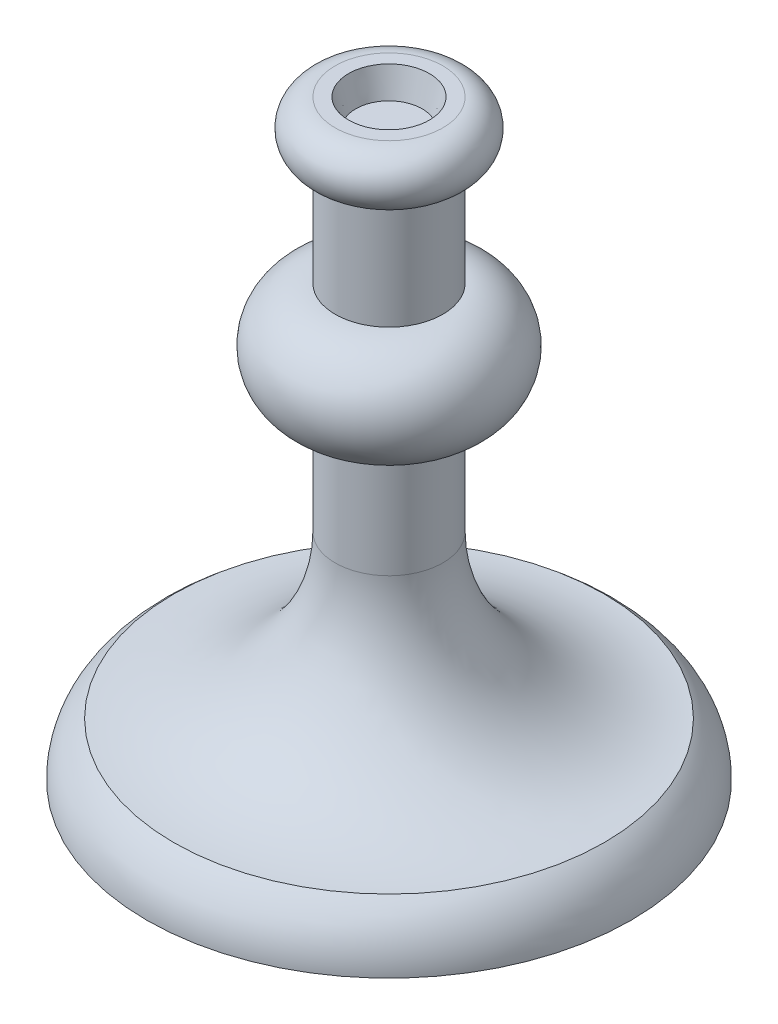
ISO-10303-21;
HEADER;
FILE_DESCRIPTION(('STEP AP214'),'2;1');
FILE_NAME('part.step','',(''),(''),'','','');
FILE_SCHEMA(('AUTOMOTIVE_DESIGN { 1 0 10303 214 1 1 1 1 }'));
ENDSEC;
DATA;
#1=APPLICATION_CONTEXT('core data for automotive mechanical design processes');
#2=APPLICATION_PROTOCOL_DEFINITION('international standard','automotive_design',2000,#1);
#3=PRODUCT_CONTEXT('',#1,'mechanical');
#4=PRODUCT('Part','Part','',(#3));
#5=PRODUCT_RELATED_PRODUCT_CATEGORY('part','',(#4));
#6=PRODUCT_DEFINITION_FORMATION('','',#4);
#7=PRODUCT_DEFINITION_CONTEXT('part definition',#1,'design');
#8=PRODUCT_DEFINITION('design','',#6,#7);
#9=PRODUCT_DEFINITION_SHAPE('','',#8);
#10=(LENGTH_UNIT() NAMED_UNIT(*) SI_UNIT(.MILLI.,.METRE.));
#11=(NAMED_UNIT(*) PLANE_ANGLE_UNIT() SI_UNIT($,.RADIAN.));
#12=(NAMED_UNIT(*) SI_UNIT($,.STERADIAN.) SOLID_ANGLE_UNIT());
#13=UNCERTAINTY_MEASURE_WITH_UNIT(LENGTH_MEASURE(1.E-05),#10,'distance_accuracy_value','');
#14=(GEOMETRIC_REPRESENTATION_CONTEXT(3) GLOBAL_UNCERTAINTY_ASSIGNED_CONTEXT((#13)) GLOBAL_UNIT_ASSIGNED_CONTEXT((#10,
#11,#12)) REPRESENTATION_CONTEXT('',''));
#15=CARTESIAN_POINT('',(0.,0.,0.));
#16=DIRECTION('',(0.,0.,1.));
#17=DIRECTION('',(1.,0.,0.));
#18=AXIS2_PLACEMENT_3D('',#15,#16,#17);
#19=CARTESIAN_POINT('',(0.,0.,0.));
#20=DIRECTION('',(0.,-1.,0.));
#21=DIRECTION('',(0.,0.,-1.));
#22=AXIS2_PLACEMENT_3D('',#19,#20,#21);
#23=PLANE('',#22);
#24=CARTESIAN_POINT('',(0.,0.,0.));
#25=DIRECTION('',(0.,-1.,0.));
#26=DIRECTION('',(0.,0.,-1.));
#27=AXIS2_PLACEMENT_3D('',#24,#25,#26);
#28=CIRCLE('',#27,90.);
#29=CARTESIAN_POINT('',(0.,0.,-90.));
#30=VERTEX_POINT('',#29);
#31=EDGE_CURVE('E10',#30,#30,#28,.T.);
#32=ORIENTED_EDGE('',*,*,#31,.T.);
#33=EDGE_LOOP('',(#32));
#34=FACE_BOUND('',#33,.T.);
#35=ADVANCED_FACE('F30',(#34),#23,.T.);
#36=CARTESIAN_POINT('',(0.,0.,0.));
#37=DIRECTION('',(0.,-1.,0.));
#38=DIRECTION('',(0.,0.,-1.));
#39=AXIS2_PLACEMENT_3D('',#36,#37,#38);
#40=TOROIDAL_SURFACE('',#39,65.,25.);
#41=CARTESIAN_POINT('',(0.,20.,0.));
#42=DIRECTION('',(0.,-1.,0.));
#43=DIRECTION('',(0.,0.,-1.));
#44=AXIS2_PLACEMENT_3D('',#41,#42,#43);
#45=CIRCLE('',#44,80.);
#46=CARTESIAN_POINT('',(0.,20.,-80.));
#47=VERTEX_POINT('',#46);
#48=EDGE_CURVE('E36',#47,#47,#45,.T.);
#49=ORIENTED_EDGE('',*,*,#48,.T.);
#50=EDGE_LOOP('',(#49));
#51=FACE_BOUND('',#50,.T.);
#52=ORIENTED_EDGE('',*,*,#31,.F.);
#53=EDGE_LOOP('',(#52));
#54=FACE_BOUND('',#53,.T.);
#55=ADVANCED_FACE('F100',(#51,#54),#40,.T.);
#56=CARTESIAN_POINT('',(0.,80.,0.));
#57=DIRECTION('',(0.,-1.,0.));
#58=DIRECTION('',(0.,0.,-1.));
#59=AXIS2_PLACEMENT_3D('',#56,#57,#58);
#60=TOROIDAL_SURFACE('',#59,80.,60.);
#61=CARTESIAN_POINT('',(0.,80.,0.));
#62=DIRECTION('',(0.,-1.,0.));
#63=DIRECTION('',(0.,0.,-1.));
#64=AXIS2_PLACEMENT_3D('',#61,#62,#63);
#65=CIRCLE('',#64,20.);
#66=CARTESIAN_POINT('',(0.,80.,-20.));
#67=VERTEX_POINT('',#66);
#68=EDGE_CURVE('E40',#67,#67,#65,.T.);
#69=ORIENTED_EDGE('',*,*,#68,.T.);
#70=EDGE_LOOP('',(#69));
#71=FACE_BOUND('',#70,.T.);
#72=ORIENTED_EDGE('',*,*,#48,.F.);
#73=EDGE_LOOP('',(#72));
#74=FACE_BOUND('',#73,.T.);
#75=ADVANCED_FACE('F94',(#71,#74),#60,.F.);
#76=CARTESIAN_POINT('',(0.,0.,0.));
#77=DIRECTION('',(0.,-1.,0.));
#78=DIRECTION('',(0.,0.,-1.));
#79=AXIS2_PLACEMENT_3D('',#76,#77,#78);
#80=CYLINDRICAL_SURFACE('',#79,20.);
#81=CARTESIAN_POINT('',(0.,120.,0.));
#82=DIRECTION('',(0.,-1.,0.));
#83=DIRECTION('',(0.,0.,-1.));
#84=AXIS2_PLACEMENT_3D('',#81,#82,#83);
#85=CIRCLE('',#84,20.);
#86=CARTESIAN_POINT('',(0.,120.,-20.));
#87=VERTEX_POINT('',#86);
#88=EDGE_CURVE('E44',#87,#87,#85,.T.);
#89=ORIENTED_EDGE('',*,*,#88,.T.);
#90=EDGE_LOOP('',(#89));
#91=FACE_BOUND('',#90,.T.);
#92=ORIENTED_EDGE('',*,*,#68,.F.);
#93=EDGE_LOOP('',(#92));
#94=FACE_BOUND('',#93,.T.);
#95=ADVANCED_FACE('F88',(#91,#94),#80,.T.);
#96=CARTESIAN_POINT('',(0.,140.,0.));
#97=DIRECTION('',(0.,-1.,0.));
#98=DIRECTION('',(0.,0.,-1.));
#99=AXIS2_PLACEMENT_3D('',#96,#97,#98);
#100=TOROIDAL_SURFACE('',#99,20.,20.);
#101=CARTESIAN_POINT('',(0.,160.,0.));
#102=DIRECTION('',(0.,-1.,0.));
#103=DIRECTION('',(0.,0.,-1.));
#104=AXIS2_PLACEMENT_3D('',#101,#102,#103);
#105=CIRCLE('',#104,20.);
#106=CARTESIAN_POINT('',(0.,160.,-20.));
#107=VERTEX_POINT('',#106);
#108=EDGE_CURVE('E49',#107,#107,#105,.T.);
#109=ORIENTED_EDGE('',*,*,#108,.T.);
#110=EDGE_LOOP('',(#109));
#111=FACE_BOUND('',#110,.T.);
#112=ORIENTED_EDGE('',*,*,#88,.F.);
#113=EDGE_LOOP('',(#112));
#114=FACE_BOUND('',#113,.T.);
#115=ADVANCED_FACE('F82',(#111,#114),#100,.T.);
#116=CARTESIAN_POINT('',(0.,0.,0.));
#117=DIRECTION('',(0.,-1.,0.));
#118=DIRECTION('',(0.,0.,-1.));
#119=AXIS2_PLACEMENT_3D('',#116,#117,#118);
#120=CYLINDRICAL_SURFACE('',#119,20.);
#121=CARTESIAN_POINT('',(0.,200.,0.));
#122=DIRECTION('',(0.,-1.,0.));
#123=DIRECTION('',(0.,0.,-1.));
#124=AXIS2_PLACEMENT_3D('',#121,#122,#123);
#125=CIRCLE('',#124,20.);
#126=CARTESIAN_POINT('',(0.,200.,-20.));
#127=VERTEX_POINT('',#126);
#128=EDGE_CURVE('E52',#127,#127,#125,.T.);
#129=ORIENTED_EDGE('',*,*,#128,.T.);
#130=EDGE_LOOP('',(#129));
#131=FACE_BOUND('',#130,.T.);
#132=ORIENTED_EDGE('',*,*,#108,.F.);
#133=EDGE_LOOP('',(#132));
#134=FACE_BOUND('',#133,.T.);
#135=ADVANCED_FACE('F76',(#131,#134),#120,.T.);
#136=CARTESIAN_POINT('',(0.,210.,0.));
#137=DIRECTION('',(0.,-1.,0.));
#138=DIRECTION('',(0.,0.,-1.));
#139=AXIS2_PLACEMENT_3D('',#136,#137,#138);
#140=TOROIDAL_SURFACE('',#139,20.,10.);
#141=CARTESIAN_POINT('',(0.,220.,0.));
#142=DIRECTION('',(0.,-1.,0.));
#143=DIRECTION('',(0.,0.,-1.));
#144=AXIS2_PLACEMENT_3D('',#141,#142,#143);
#145=CIRCLE('',#144,20.);
#146=CARTESIAN_POINT('',(0.,220.,-20.));
#147=VERTEX_POINT('',#146);
#148=EDGE_CURVE('E55',#147,#147,#145,.T.);
#149=ORIENTED_EDGE('',*,*,#148,.T.);
#150=EDGE_LOOP('',(#149));
#151=FACE_BOUND('',#150,.T.);
#152=ORIENTED_EDGE('',*,*,#128,.F.);
#153=EDGE_LOOP('',(#152));
#154=FACE_BOUND('',#153,.T.);
#155=ADVANCED_FACE('F70',(#151,#154),#140,.T.);
#156=CARTESIAN_POINT('',(0.,220.,0.));
#157=DIRECTION('',(0.,1.,0.));
#158=DIRECTION('',(0.,0.,1.));
#159=AXIS2_PLACEMENT_3D('',#156,#157,#158);
#160=PLANE('',#159);
#161=CARTESIAN_POINT('',(0.,220.,0.));
#162=DIRECTION('',(0.,1.,0.));
#163=DIRECTION('',(0.,0.,1.));
#164=AXIS2_PLACEMENT_3D('',#161,#162,#163);
#165=CIRCLE('',#164,15.);
#166=CARTESIAN_POINT('',(0.,220.,15.));
#167=VERTEX_POINT('',#166);
#168=EDGE_CURVE('E61',#167,#167,#165,.T.);
#169=ORIENTED_EDGE('',*,*,#168,.F.);
#170=EDGE_LOOP('',(#169));
#171=FACE_BOUND('',#170,.T.);
#172=ORIENTED_EDGE('',*,*,#148,.F.);
#173=EDGE_LOOP('',(#172));
#174=FACE_BOUND('',#173,.T.);
#175=ADVANCED_FACE('F67',(#171,#174),#160,.T.);
#176=CARTESIAN_POINT('',(0.,220.,0.));
#177=DIRECTION('',(0.,1.,0.));
#178=DIRECTION('',(0.,0.,1.));
#179=AXIS2_PLACEMENT_3D('',#176,#177,#178);
#180=CONICAL_SURFACE('',#179,15.,0.26179938779915);
#181=CARTESIAN_POINT('',(0.,210.,0.));
#182=DIRECTION('',(0.,1.,0.));
#183=DIRECTION('',(0.,0.,1.));
#184=AXIS2_PLACEMENT_3D('',#181,#182,#183);
#185=CIRCLE('',#184,12.3205080756888);
#186=CARTESIAN_POINT('',(0.,210.,12.3205080756888));
#187=VERTEX_POINT('',#186);
#188=EDGE_CURVE('E58',#187,#187,#185,.T.);
#189=ORIENTED_EDGE('',*,*,#188,.F.);
#190=EDGE_LOOP('',(#189));
#191=FACE_BOUND('',#190,.T.);
#192=ORIENTED_EDGE('',*,*,#168,.T.);
#193=EDGE_LOOP('',(#192));
#194=FACE_BOUND('',#193,.T.);
#195=ADVANCED_FACE('F65',(#191,#194),#180,.F.);
#196=CARTESIAN_POINT('',(0.,210.,0.));
#197=DIRECTION('',(0.,1.,0.));
#198=DIRECTION('',(0.,0.,1.));
#199=AXIS2_PLACEMENT_3D('',#196,#197,#198);
#200=PLANE('',#199);
#201=ORIENTED_EDGE('',*,*,#188,.T.);
#202=EDGE_LOOP('',(#201));
#203=FACE_BOUND('',#202,.T.);
#204=ADVANCED_FACE('F155',(#203),#200,.T.);
#205=CLOSED_SHELL('',(#35,#55,#75,#95,#115,#135,#155,#175,#195,#204));
#206=MANIFOLD_SOLID_BREP('B2',#205);
#207=ADVANCED_BREP_SHAPE_REPRESENTATION('',(#18,#206),#14);
#208=SHAPE_DEFINITION_REPRESENTATION(#9,#207);
ENDSEC;
END-ISO-10303-21;
